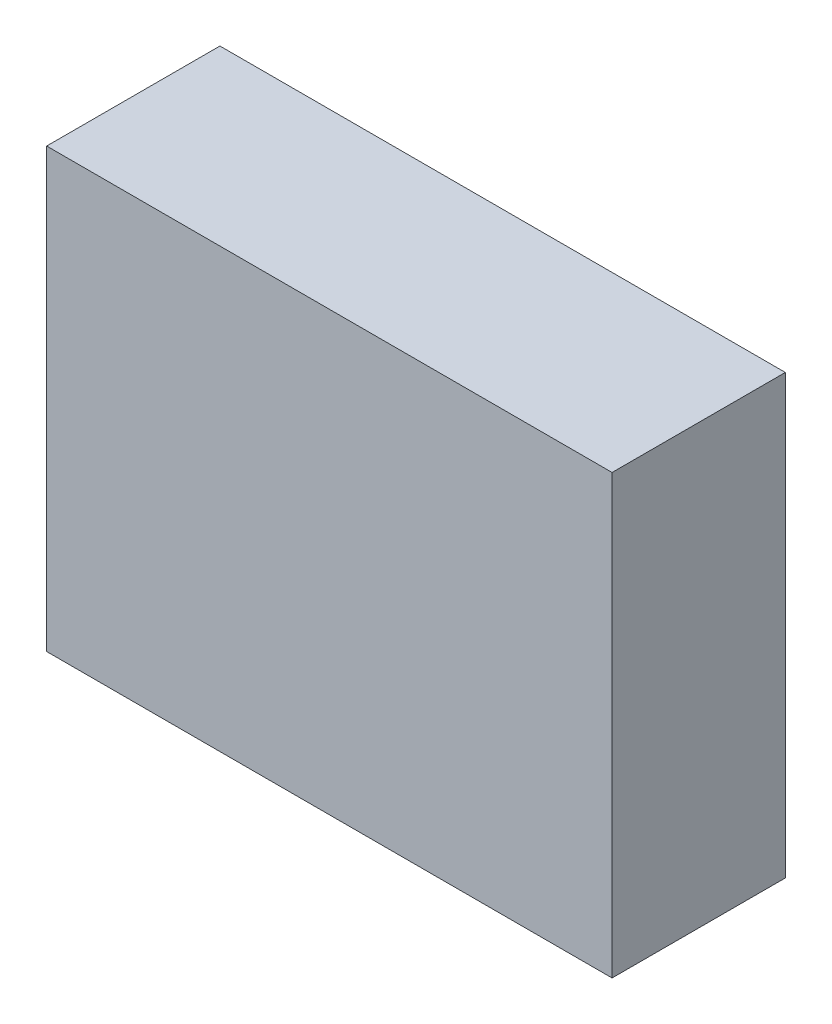
ISO-10303-21;
HEADER;
FILE_DESCRIPTION(('STEP AP214'),'2;1');
FILE_NAME('part.step','',(''),(''),'','','');
FILE_SCHEMA(('AUTOMOTIVE_DESIGN { 1 0 10303 214 1 1 1 1 }'));
ENDSEC;
DATA;
#1=APPLICATION_CONTEXT('core data for automotive mechanical design processes');
#2=APPLICATION_PROTOCOL_DEFINITION('international standard','automotive_design',2000,#1);
#3=PRODUCT_CONTEXT('',#1,'mechanical');
#4=PRODUCT('Part','Part','',(#3));
#5=PRODUCT_RELATED_PRODUCT_CATEGORY('part','',(#4));
#6=PRODUCT_DEFINITION_FORMATION('','',#4);
#7=PRODUCT_DEFINITION_CONTEXT('part definition',#1,'design');
#8=PRODUCT_DEFINITION('design','',#6,#7);
#9=PRODUCT_DEFINITION_SHAPE('','',#8);
#10=(LENGTH_UNIT() NAMED_UNIT(*) SI_UNIT(.MILLI.,.METRE.));
#11=(NAMED_UNIT(*) PLANE_ANGLE_UNIT() SI_UNIT($,.RADIAN.));
#12=(NAMED_UNIT(*) SI_UNIT($,.STERADIAN.) SOLID_ANGLE_UNIT());
#13=UNCERTAINTY_MEASURE_WITH_UNIT(LENGTH_MEASURE(1.E-05),#10,'distance_accuracy_value','');
#14=(GEOMETRIC_REPRESENTATION_CONTEXT(3) GLOBAL_UNCERTAINTY_ASSIGNED_CONTEXT((#13)) GLOBAL_UNIT_ASSIGNED_CONTEXT((#10,
#11,#12)) REPRESENTATION_CONTEXT('',''));
#15=CARTESIAN_POINT('',(0.,0.,0.));
#16=DIRECTION('',(0.,0.,1.));
#17=DIRECTION('',(1.,0.,0.));
#18=AXIS2_PLACEMENT_3D('',#15,#16,#17);
#19=CARTESIAN_POINT('',(-1.6635,-1.2635,1.));
#20=DIRECTION('',(1.,0.,0.));
#21=DIRECTION('',(0.,0.,-1.));
#22=AXIS2_PLACEMENT_3D('',#19,#20,#21);
#23=PLANE('',#22);
#24=DIRECTION('',(0.,-1.,0.));
#25=VECTOR('',#24,1.);
#26=CARTESIAN_POINT('',(-1.6635,-1.2635,0.));
#27=LINE('',#26,#25);
#28=CARTESIAN_POINT('',(-1.6635,1.2635,0.));
#29=VERTEX_POINT('',#28);
#30=CARTESIAN_POINT('',(-1.6635,-1.2635,0.));
#31=VERTEX_POINT('',#30);
#32=EDGE_CURVE('E96',#29,#31,#27,.T.);
#33=ORIENTED_EDGE('',*,*,#32,.T.);
#34=DIRECTION('',(0.,0.,-1.));
#35=VECTOR('',#34,1.);
#36=CARTESIAN_POINT('',(-1.6635,-1.2635,1.));
#37=LINE('',#36,#35);
#38=CARTESIAN_POINT('',(-1.6635,-1.2635,1.));
#39=VERTEX_POINT('',#38);
#40=EDGE_CURVE('E11',#39,#31,#37,.T.);
#41=ORIENTED_EDGE('',*,*,#40,.F.);
#42=DIRECTION('',(0.,-1.,0.));
#43=VECTOR('',#42,1.);
#44=CARTESIAN_POINT('',(-1.6635,-1.2635,1.));
#45=LINE('',#44,#43);
#46=CARTESIAN_POINT('',(-1.6635,1.2635,1.));
#47=VERTEX_POINT('',#46);
#48=EDGE_CURVE('E84',#47,#39,#45,.T.);
#49=ORIENTED_EDGE('',*,*,#48,.F.);
#50=DIRECTION('',(0.,0.,-1.));
#51=VECTOR('',#50,1.);
#52=CARTESIAN_POINT('',(-1.6635,1.2635,1.));
#53=LINE('',#52,#51);
#54=EDGE_CURVE('E92',#47,#29,#53,.T.);
#55=ORIENTED_EDGE('',*,*,#54,.T.);
#56=EDGE_LOOP('',(#33,#41,#49,#55));
#57=FACE_BOUND('',#56,.T.);
#58=ADVANCED_FACE('F33',(#57),#23,.F.);
#59=CARTESIAN_POINT('',(1.6,-1.2635,1.));
#60=DIRECTION('',(0.,1.,0.));
#61=DIRECTION('',(0.,0.,1.));
#62=AXIS2_PLACEMENT_3D('',#59,#60,#61);
#63=PLANE('',#62);
#64=DIRECTION('',(1.,0.,0.));
#65=VECTOR('',#64,1.);
#66=CARTESIAN_POINT('',(1.6,-1.2635,0.));
#67=LINE('',#66,#65);
#68=CARTESIAN_POINT('',(1.6,-1.2635,0.));
#69=VERTEX_POINT('',#68);
#70=EDGE_CURVE('E88',#31,#69,#67,.T.);
#71=ORIENTED_EDGE('',*,*,#70,.T.);
#72=DIRECTION('',(0.,0.,-1.));
#73=VECTOR('',#72,1.);
#74=CARTESIAN_POINT('',(1.6,-1.2635,1.));
#75=LINE('',#74,#73);
#76=CARTESIAN_POINT('',(1.6,-1.2635,1.));
#77=VERTEX_POINT('',#76);
#78=EDGE_CURVE('E41',#77,#69,#75,.T.);
#79=ORIENTED_EDGE('',*,*,#78,.F.);
#80=DIRECTION('',(1.,0.,0.));
#81=VECTOR('',#80,1.);
#82=CARTESIAN_POINT('',(1.6,-1.2635,1.));
#83=LINE('',#82,#81);
#84=EDGE_CURVE('E79',#39,#77,#83,.T.);
#85=ORIENTED_EDGE('',*,*,#84,.F.);
#86=ORIENTED_EDGE('',*,*,#40,.T.);
#87=EDGE_LOOP('',(#71,#79,#85,#86));
#88=FACE_BOUND('',#87,.T.);
#89=ADVANCED_FACE('F87',(#88),#63,.F.);
#90=CARTESIAN_POINT('',(1.6,1.2635,1.));
#91=DIRECTION('',(-1.,0.,0.));
#92=DIRECTION('',(0.,0.,1.));
#93=AXIS2_PLACEMENT_3D('',#90,#91,#92);
#94=PLANE('',#93);
#95=DIRECTION('',(0.,1.,0.));
#96=VECTOR('',#95,1.);
#97=CARTESIAN_POINT('',(1.6,1.2635,0.));
#98=LINE('',#97,#96);
#99=CARTESIAN_POINT('',(1.6,1.2635,0.));
#100=VERTEX_POINT('',#99);
#101=EDGE_CURVE('E66',#69,#100,#98,.T.);
#102=ORIENTED_EDGE('',*,*,#101,.T.);
#103=DIRECTION('',(0.,0.,-1.));
#104=VECTOR('',#103,1.);
#105=CARTESIAN_POINT('',(1.6,1.2635,1.));
#106=LINE('',#105,#104);
#107=CARTESIAN_POINT('',(1.6,1.2635,1.));
#108=VERTEX_POINT('',#107);
#109=EDGE_CURVE('E89',#108,#100,#106,.T.);
#110=ORIENTED_EDGE('',*,*,#109,.F.);
#111=DIRECTION('',(0.,1.,0.));
#112=VECTOR('',#111,1.);
#113=CARTESIAN_POINT('',(1.6,1.2635,1.));
#114=LINE('',#113,#112);
#115=EDGE_CURVE('E82',#77,#108,#114,.T.);
#116=ORIENTED_EDGE('',*,*,#115,.F.);
#117=ORIENTED_EDGE('',*,*,#78,.T.);
#118=EDGE_LOOP('',(#102,#110,#116,#117));
#119=FACE_BOUND('',#118,.T.);
#120=ADVANCED_FACE('F90',(#119),#94,.F.);
#121=CARTESIAN_POINT('',(-1.6635,1.2635,1.));
#122=DIRECTION('',(0.,-1.,0.));
#123=DIRECTION('',(0.,0.,-1.));
#124=AXIS2_PLACEMENT_3D('',#121,#122,#123);
#125=PLANE('',#124);
#126=DIRECTION('',(-1.,0.,0.));
#127=VECTOR('',#126,1.);
#128=CARTESIAN_POINT('',(-1.6635,1.2635,0.));
#129=LINE('',#128,#127);
#130=EDGE_CURVE('E72',#100,#29,#129,.T.);
#131=ORIENTED_EDGE('',*,*,#130,.T.);
#132=ORIENTED_EDGE('',*,*,#54,.F.);
#133=DIRECTION('',(-1.,0.,0.));
#134=VECTOR('',#133,1.);
#135=CARTESIAN_POINT('',(-1.6635,1.2635,1.));
#136=LINE('',#135,#134);
#137=EDGE_CURVE('E49',#108,#47,#136,.T.);
#138=ORIENTED_EDGE('',*,*,#137,.F.);
#139=ORIENTED_EDGE('',*,*,#109,.T.);
#140=EDGE_LOOP('',(#131,#132,#138,#139));
#141=FACE_BOUND('',#140,.T.);
#142=ADVANCED_FACE('F103',(#141),#125,.F.);
#143=CARTESIAN_POINT('',(0.,0.,1.));
#144=DIRECTION('',(0.,0.,-1.));
#145=DIRECTION('',(-1.,0.,0.));
#146=AXIS2_PLACEMENT_3D('',#143,#144,#145);
#147=PLANE('',#146);
#148=ORIENTED_EDGE('',*,*,#48,.T.);
#149=ORIENTED_EDGE('',*,*,#84,.T.);
#150=ORIENTED_EDGE('',*,*,#115,.T.);
#151=ORIENTED_EDGE('',*,*,#137,.T.);
#152=EDGE_LOOP('',(#148,#149,#150,#151));
#153=FACE_BOUND('',#152,.T.);
#154=ADVANCED_FACE('F80',(#153),#147,.F.);
#155=CARTESIAN_POINT('',(0.,0.,0.));
#156=DIRECTION('',(0.,0.,-1.));
#157=DIRECTION('',(-1.,0.,0.));
#158=AXIS2_PLACEMENT_3D('',#155,#156,#157);
#159=PLANE('',#158);
#160=ORIENTED_EDGE('',*,*,#32,.F.);
#161=ORIENTED_EDGE('',*,*,#130,.F.);
#162=ORIENTED_EDGE('',*,*,#101,.F.);
#163=ORIENTED_EDGE('',*,*,#70,.F.);
#164=EDGE_LOOP('',(#160,#161,#162,#163));
#165=FACE_BOUND('',#164,.T.);
#166=ADVANCED_FACE('F106',(#165),#159,.T.);
#167=CLOSED_SHELL('',(#58,#89,#120,#142,#154,#166));
#168=MANIFOLD_SOLID_BREP('B2',#167);
#169=ADVANCED_BREP_SHAPE_REPRESENTATION('',(#18,#168),#14);
#170=SHAPE_DEFINITION_REPRESENTATION(#9,#169);
ENDSEC;
END-ISO-10303-21;
